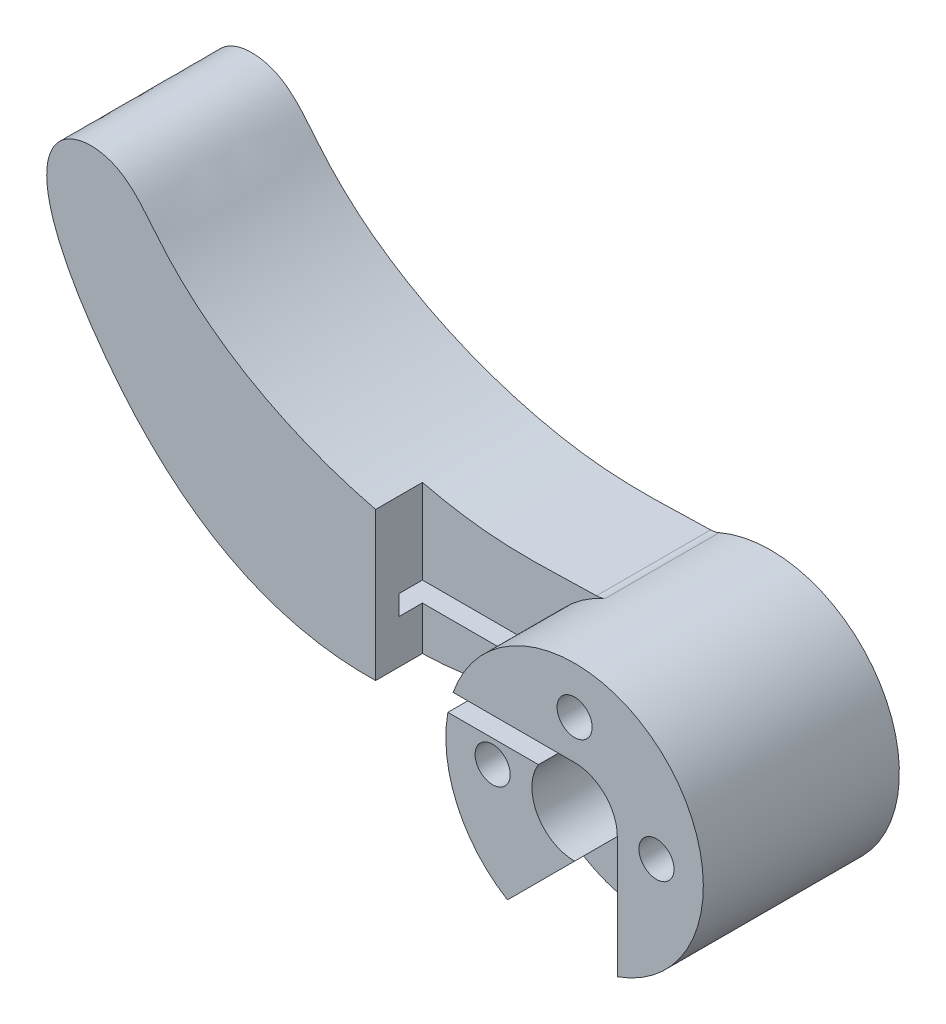
ISO-10303-21;
HEADER;
FILE_DESCRIPTION(('STEP AP214'),'2;1');
FILE_NAME('part.step','',(''),(''),'','','');
FILE_SCHEMA(('AUTOMOTIVE_DESIGN { 1 0 10303 214 1 1 1 1 }'));
ENDSEC;
DATA;
#1=APPLICATION_CONTEXT('core data for automotive mechanical design processes');
#2=APPLICATION_PROTOCOL_DEFINITION('international standard','automotive_design',2000,#1);
#3=PRODUCT_CONTEXT('',#1,'mechanical');
#4=PRODUCT('Part','Part','',(#3));
#5=PRODUCT_RELATED_PRODUCT_CATEGORY('part','',(#4));
#6=PRODUCT_DEFINITION_FORMATION('','',#4);
#7=PRODUCT_DEFINITION_CONTEXT('part definition',#1,'design');
#8=PRODUCT_DEFINITION('design','',#6,#7);
#9=PRODUCT_DEFINITION_SHAPE('','',#8);
#10=(LENGTH_UNIT() NAMED_UNIT(*) SI_UNIT(.MILLI.,.METRE.));
#11=(NAMED_UNIT(*) PLANE_ANGLE_UNIT() SI_UNIT($,.RADIAN.));
#12=(NAMED_UNIT(*) SI_UNIT($,.STERADIAN.) SOLID_ANGLE_UNIT());
#13=UNCERTAINTY_MEASURE_WITH_UNIT(LENGTH_MEASURE(1.E-05),#10,'distance_accuracy_value','');
#14=(GEOMETRIC_REPRESENTATION_CONTEXT(3) GLOBAL_UNCERTAINTY_ASSIGNED_CONTEXT((#13)) GLOBAL_UNIT_ASSIGNED_CONTEXT((#10,
#11,#12)) REPRESENTATION_CONTEXT('',''));
#15=CARTESIAN_POINT('',(0.,0.,0.));
#16=DIRECTION('',(0.,0.,1.));
#17=DIRECTION('',(1.,0.,0.));
#18=AXIS2_PLACEMENT_3D('',#15,#16,#17);
#19=CARTESIAN_POINT('',(-3.0854497241083,-23.05,6.25));
#20=DIRECTION('',(0.,-1.,0.));
#21=DIRECTION('',(1.,0.,0.));
#22=AXIS2_PLACEMENT_3D('',#19,#20,#21);
#23=PLANE('',#22);
#24=DIRECTION('',(1.,0.,0.));
#25=VECTOR('',#24,1.);
#26=CARTESIAN_POINT('',(-20.,-23.05,11.75));
#27=LINE('',#26,#25);
#28=CARTESIAN_POINT('',(-30.,-23.05,11.75));
#29=VERTEX_POINT('',#28);
#30=CARTESIAN_POINT('',(-20.,-23.05,11.75));
#31=VERTEX_POINT('',#30);
#32=EDGE_CURVE('E243',#29,#31,#27,.T.);
#33=ORIENTED_EDGE('',*,*,#32,.T.);
#34=DIRECTION('',(0.,0.,-1.));
#35=VECTOR('',#34,1.);
#36=CARTESIAN_POINT('',(-20.,-23.05,44.75));
#37=LINE('',#36,#35);
#38=CARTESIAN_POINT('',(-20.,-23.05,9.75));
#39=VERTEX_POINT('',#38);
#40=EDGE_CURVE('E274',#31,#39,#37,.T.);
#41=ORIENTED_EDGE('',*,*,#40,.T.);
#42=DIRECTION('',(1.,0.,0.));
#43=VECTOR('',#42,1.);
#44=CARTESIAN_POINT('',(-20.,-23.05,9.75));
#45=LINE('',#44,#43);
#46=CARTESIAN_POINT('',(-10.8257794176678,-23.05,9.75));
#47=VERTEX_POINT('',#46);
#48=EDGE_CURVE('E272',#39,#47,#45,.T.);
#49=ORIENTED_EDGE('',*,*,#48,.T.);
#50=DIRECTION('',(0.,0.,-1.));
#51=VECTOR('',#50,1.);
#52=CARTESIAN_POINT('',(-10.8257794176678,-23.05,44.8626983722081));
#53=LINE('',#52,#51);
#54=CARTESIAN_POINT('',(-10.8257794176678,-23.05,16.75));
#55=VERTEX_POINT('',#54);
#56=EDGE_CURVE('E497',#47,#55,#53,.F.);
#57=ORIENTED_EDGE('',*,*,#56,.T.);
#58=DIRECTION('',(-1.,0.,0.));
#59=VECTOR('',#58,1.);
#60=CARTESIAN_POINT('',(-3.0854497241083,-23.05,16.75));
#61=LINE('',#60,#59);
#62=CARTESIAN_POINT('',(-3.0854497241083,-23.05,16.75));
#63=VERTEX_POINT('',#62);
#64=EDGE_CURVE('E202',#63,#55,#61,.T.);
#65=ORIENTED_EDGE('',*,*,#64,.F.);
#66=DIRECTION('',(0.,0.,1.));
#67=VECTOR('',#66,1.);
#68=CARTESIAN_POINT('',(-3.0854497241083,-23.05,6.25));
#69=LINE('',#68,#67);
#70=CARTESIAN_POINT('',(-3.0854497241083,-23.05,6.25));
#71=VERTEX_POINT('',#70);
#72=EDGE_CURVE('E259',#71,#63,#69,.T.);
#73=ORIENTED_EDGE('',*,*,#72,.F.);
#74=DIRECTION('',(1.,0.,0.));
#75=VECTOR('',#74,1.);
#76=CARTESIAN_POINT('',(-3.0854497241083,-23.05,6.25));
#77=LINE('',#76,#75);
#78=CARTESIAN_POINT('',(-5.1325150603017,-23.05,6.25));
#79=VERTEX_POINT('',#78);
#80=EDGE_CURVE('E254',#79,#71,#77,.T.);
#81=ORIENTED_EDGE('',*,*,#80,.F.);
#82=DIRECTION('',(0.,0.,-1.));
#83=VECTOR('',#82,1.);
#84=CARTESIAN_POINT('',(-5.1325150603017,-23.05,13.25));
#85=LINE('',#84,#83);
#86=CARTESIAN_POINT('',(-5.1325150603017,-23.05,13.25));
#87=VERTEX_POINT('',#86);
#88=EDGE_CURVE('E278',#79,#87,#85,.F.);
#89=ORIENTED_EDGE('',*,*,#88,.T.);
#90=DIRECTION('',(-1.,0.,0.));
#91=VECTOR('',#90,1.);
#92=CARTESIAN_POINT('',(-7.,-23.05,13.25));
#93=LINE('',#92,#91);
#94=CARTESIAN_POINT('',(-8.86748493969831,-23.05,13.25));
#95=VERTEX_POINT('',#94);
#96=EDGE_CURVE('E276',#87,#95,#93,.T.);
#97=ORIENTED_EDGE('',*,*,#96,.T.);
#98=DIRECTION('',(0.,0.,-1.));
#99=VECTOR('',#98,1.);
#100=CARTESIAN_POINT('',(-8.86748493969831,-23.05,13.25));
#101=LINE('',#100,#99);
#102=CARTESIAN_POINT('',(-8.86748493969831,-23.05,6.25));
#103=VERTEX_POINT('',#102);
#104=EDGE_CURVE('E280',#95,#103,#101,.T.);
#105=ORIENTED_EDGE('',*,*,#104,.T.);
#106=CARTESIAN_POINT('',(-30.,-23.05,6.25));
#107=VERTEX_POINT('',#106);
#108=EDGE_CURVE('E255',#107,#103,#77,.T.);
#109=ORIENTED_EDGE('',*,*,#108,.F.);
#110=DIRECTION('',(0.,0.,1.));
#111=VECTOR('',#110,1.);
#112=CARTESIAN_POINT('',(-30.,-23.05,6.25));
#113=LINE('',#112,#111);
#114=EDGE_CURVE('E262',#107,#29,#113,.T.);
#115=ORIENTED_EDGE('',*,*,#114,.T.);
#116=EDGE_LOOP('',(#33,#41,#49,#57,#65,#73,#81,#89,#97,#105,#109,#115));
#117=FACE_BOUND('',#116,.T.);
#118=ADVANCED_FACE('F33',(#117),#23,.F.);
#119=CARTESIAN_POINT('',(-30.,-21.35,6.25));
#120=DIRECTION('',(-1.,0.,0.));
#121=DIRECTION('',(0.,-1.,0.));
#122=AXIS2_PLACEMENT_3D('',#119,#120,#121);
#123=PLANE('',#122);
#124=DIRECTION('',(0.,-1.,0.));
#125=VECTOR('',#124,1.);
#126=CARTESIAN_POINT('',(-30.,-23.05,11.75));
#127=LINE('',#126,#125);
#128=CARTESIAN_POINT('',(-30.,-21.35,11.75));
#129=VERTEX_POINT('',#128);
#130=EDGE_CURVE('E241',#129,#29,#127,.T.);
#131=ORIENTED_EDGE('',*,*,#130,.T.);
#132=ORIENTED_EDGE('',*,*,#114,.F.);
#133=DIRECTION('',(0.,-1.,0.));
#134=VECTOR('',#133,1.);
#135=CARTESIAN_POINT('',(-30.,-21.35,6.25));
#136=LINE('',#135,#134);
#137=CARTESIAN_POINT('',(-30.,-21.35,6.25));
#138=VERTEX_POINT('',#137);
#139=EDGE_CURVE('E251',#138,#107,#136,.T.);
#140=ORIENTED_EDGE('',*,*,#139,.F.);
#141=DIRECTION('',(0.,0.,1.));
#142=VECTOR('',#141,1.);
#143=CARTESIAN_POINT('',(-30.,-21.35,6.25));
#144=LINE('',#143,#142);
#145=EDGE_CURVE('E265',#138,#129,#144,.T.);
#146=ORIENTED_EDGE('',*,*,#145,.T.);
#147=EDGE_LOOP('',(#131,#132,#140,#146));
#148=FACE_BOUND('',#147,.T.);
#149=ADVANCED_FACE('F376',(#148),#123,.F.);
#150=CARTESIAN_POINT('',(0.,-21.35,6.25));
#151=DIRECTION('',(0.,1.,0.));
#152=DIRECTION('',(-1.,0.,0.));
#153=AXIS2_PLACEMENT_3D('',#150,#151,#152);
#154=PLANE('',#153);
#155=DIRECTION('',(-1.,0.,0.));
#156=VECTOR('',#155,1.);
#157=CARTESIAN_POINT('',(-20.,-21.35,11.75));
#158=LINE('',#157,#156);
#159=CARTESIAN_POINT('',(-20.,-21.35,11.75));
#160=VERTEX_POINT('',#159);
#161=EDGE_CURVE('E239',#160,#129,#158,.T.);
#162=ORIENTED_EDGE('',*,*,#161,.T.);
#163=ORIENTED_EDGE('',*,*,#145,.F.);
#164=DIRECTION('',(-1.,0.,0.));
#165=VECTOR('',#164,1.);
#166=CARTESIAN_POINT('',(0.,-21.35,6.25));
#167=LINE('',#166,#165);
#168=CARTESIAN_POINT('',(0.,-21.35,6.25));
#169=VERTEX_POINT('',#168);
#170=EDGE_CURVE('E248',#169,#138,#167,.T.);
#171=ORIENTED_EDGE('',*,*,#170,.F.);
#172=DIRECTION('',(0.,0.,1.));
#173=VECTOR('',#172,1.);
#174=CARTESIAN_POINT('',(0.,-21.35,6.25));
#175=LINE('',#174,#173);
#176=CARTESIAN_POINT('',(0.,-21.35,16.75));
#177=VERTEX_POINT('',#176);
#178=EDGE_CURVE('E258',#169,#177,#175,.T.);
#179=ORIENTED_EDGE('',*,*,#178,.T.);
#180=DIRECTION('',(1.,0.,0.));
#181=VECTOR('',#180,1.);
#182=CARTESIAN_POINT('',(-10.3767769562615,-21.35,16.75));
#183=LINE('',#182,#181);
#184=CARTESIAN_POINT('',(-10.3767769562615,-21.35,16.75));
#185=VERTEX_POINT('',#184);
#186=EDGE_CURVE('E225',#185,#177,#183,.T.);
#187=ORIENTED_EDGE('',*,*,#186,.F.);
#188=DIRECTION('',(0.,0.,-1.));
#189=VECTOR('',#188,1.);
#190=CARTESIAN_POINT('',(-10.3767769562615,-21.35,44.8626983722081));
#191=LINE('',#190,#189);
#192=CARTESIAN_POINT('',(-10.3767769562615,-21.35,9.75));
#193=VERTEX_POINT('',#192);
#194=EDGE_CURVE('E495',#185,#193,#191,.T.);
#195=ORIENTED_EDGE('',*,*,#194,.T.);
#196=DIRECTION('',(-1.,0.,0.));
#197=VECTOR('',#196,1.);
#198=CARTESIAN_POINT('',(-20.,-21.35,9.75));
#199=LINE('',#198,#197);
#200=CARTESIAN_POINT('',(-20.,-21.35,9.75));
#201=VERTEX_POINT('',#200);
#202=EDGE_CURVE('E261',#193,#201,#199,.T.);
#203=ORIENTED_EDGE('',*,*,#202,.T.);
#204=DIRECTION('',(0.,0.,1.));
#205=VECTOR('',#204,1.);
#206=CARTESIAN_POINT('',(-20.,-21.35,44.75));
#207=LINE('',#206,#205);
#208=EDGE_CURVE('E270',#201,#160,#207,.T.);
#209=ORIENTED_EDGE('',*,*,#208,.T.);
#210=EDGE_LOOP('',(#162,#163,#171,#179,#187,#195,#203,#209));
#211=FACE_BOUND('',#210,.T.);
#212=ADVANCED_FACE('F382',(#211),#154,.F.);
#213=CARTESIAN_POINT('',(-20.,5.,9.75));
#214=DIRECTION('',(0.,0.,1.));
#215=DIRECTION('',(1.,0.,0.));
#216=AXIS2_PLACEMENT_3D('',#213,#214,#215);
#217=PLANE('',#216);
#218=ORIENTED_EDGE('',*,*,#48,.F.);
#219=DIRECTION('',(0.,-1.,0.));
#220=VECTOR('',#219,1.);
#221=CARTESIAN_POINT('',(-20.,5.,9.75));
#222=LINE('',#221,#220);
#223=CARTESIAN_POINT('',(-20.,-26.7885708575753,9.75));
#224=VERTEX_POINT('',#223);
#225=EDGE_CURVE('E304',#39,#224,#222,.T.);
#226=ORIENTED_EDGE('',*,*,#225,.T.);
#227=CARTESIAN_POINT('',(-43.,-14.4816893196804,9.75));
#228=CARTESIAN_POINT('',(-34.4997708015538,-25.8253196137616,9.75));
#229=CARTESIAN_POINT('',(-23.4997708015538,-29.3314231738681,9.75));
#230=CARTESIAN_POINT('',(-10.,-25.,9.75));
#231=B_SPLINE_CURVE_WITH_KNOTS('',3,(#227,#228,#229,#230),.UNSPECIFIED.,.F.,.F.,(4,4),(0.,1.),.UNSPECIFIED.);
#232=CARTESIAN_POINT('',(-13.1488810570186,-25.8789172832054,9.75));
#233=VERTEX_POINT('',#232);
#234=EDGE_CURVE('E324',#224,#233,#231,.T.);
#235=ORIENTED_EDGE('',*,*,#234,.T.);
#236=CARTESIAN_POINT('',(-12.6892548700412,-27.8253868484041,9.75));
#237=DIRECTION('',(0.,0.,1.));
#238=DIRECTION('',(1.,0.,0.));
#239=AXIS2_PLACEMENT_3D('',#236,#237,#238);
#240=CIRCLE('',#239,2.);
#241=CARTESIAN_POINT('',(-10.7370618131118,-27.3907119486496,9.75));
#242=VERTEX_POINT('',#241);
#243=EDGE_CURVE('E515',#233,#242,#240,.F.);
#244=ORIENTED_EDGE('',*,*,#243,.T.);
#245=CARTESIAN_POINT('',(0.,-25.,9.75));
#246=DIRECTION('',(0.,0.,1.));
#247=DIRECTION('',(1.,0.,0.));
#248=AXIS2_PLACEMENT_3D('',#245,#246,#247);
#249=CIRCLE('',#248,11.);
#250=EDGE_CURVE('E491',#47,#242,#249,.T.);
#251=ORIENTED_EDGE('',*,*,#250,.F.);
#252=EDGE_LOOP('',(#218,#226,#235,#244,#251));
#253=FACE_BOUND('',#252,.T.);
#254=ADVANCED_FACE('F359',(#253),#217,.T.);
#255=CARTESIAN_POINT('',(0.,-15.,54.5));
#256=CARTESIAN_POINT('',(-7.03253454263391,-15.,54.5));
#257=CARTESIAN_POINT('',(-16.8634620389375,-16.2801328042469,54.5));
#258=CARTESIAN_POINT('',(-34.3402061821673,-9.88423584322541,54.5));
#259=CARTESIAN_POINT('',(-43.3409425550574,3.4478820338478,54.5));
#260=CARTESIAN_POINT('',(-53.0005504042175,-1.13586723955291,54.5));
#261=CARTESIAN_POINT('',(-43.,-14.4816893196804,54.5));
#262=B_SPLINE_CURVE_WITH_KNOTS('',3,(#255,#256,#257,#258,#259,#260,#261),.UNSPECIFIED.,.F.,.F.,
(4,1,1,1,4),(0.,0.248294096311982,0.674131075333051,0.76028618665666,1.),.UNSPECIFIED.);
#263=DIRECTION('',(0.,0.,-1.));
#264=VECTOR('',#263,1.);
#265=SURFACE_OF_LINEAR_EXTRUSION('',#262,#264);
#266=CARTESIAN_POINT('',(0.,-15.,9.75));
#267=CARTESIAN_POINT('',(-7.03253454263391,-15.,9.75));
#268=CARTESIAN_POINT('',(-16.8634620389375,-16.2801328042469,9.75));
#269=CARTESIAN_POINT('',(-34.3402061821673,-9.88423584322541,9.75));
#270=CARTESIAN_POINT('',(-43.3409425550574,3.4478820338478,9.75));
#271=CARTESIAN_POINT('',(-53.0005504042175,-1.13586723955291,9.75));
#272=CARTESIAN_POINT('',(-43.,-14.4816893196804,9.75));
#273=B_SPLINE_CURVE_WITH_KNOTS('',3,(#266,#267,#268,#269,#270,#271,#272),.UNSPECIFIED.,.F.,.F.,
(4,1,1,1,4),(0.,0.248294096311982,0.674131075333051,0.76028618665666,1.),.UNSPECIFIED.);
#274=CARTESIAN_POINT('',(-5.12916504602776,-15.0779549061957,9.75));
#275=VERTEX_POINT('',#274);
#276=CARTESIAN_POINT('',(-20.,-14.125415076322,9.75));
#277=VERTEX_POINT('',#276);
#278=EDGE_CURVE('E329',#275,#277,#273,.T.);
#279=ORIENTED_EDGE('',*,*,#278,.F.);
#280=DIRECTION('',(0.,0.,-1.));
#281=VECTOR('',#280,1.);
#282=CARTESIAN_POINT('',(-5.12916504602776,-15.0779549061957,9.75000000000002));
#283=LINE('',#282,#281);
#284=CARTESIAN_POINT('',(-5.12916504602776,-15.0779549061957,0.));
#285=VERTEX_POINT('',#284);
#286=EDGE_CURVE('E513',#275,#285,#283,.T.);
#287=ORIENTED_EDGE('',*,*,#286,.T.);
#288=CARTESIAN_POINT('',(0.,-15.,0.));
#289=CARTESIAN_POINT('',(-7.03253454263391,-15.,0.));
#290=CARTESIAN_POINT('',(-16.8634620389375,-16.2801328042469,0.));
#291=CARTESIAN_POINT('',(-34.3402061821673,-9.88423584322541,0.));
#292=CARTESIAN_POINT('',(-43.3409425550574,3.4478820338478,0.));
#293=CARTESIAN_POINT('',(-53.0005504042175,-1.13586723955291,0.));
#294=CARTESIAN_POINT('',(-43.,-14.4816893196804,0.));
#295=B_SPLINE_CURVE_WITH_KNOTS('',3,(#288,#289,#290,#291,#292,#293,#294),.UNSPECIFIED.,.F.,.F.,
(4,1,1,1,4),(0.,0.248294096311982,0.674131075333051,0.76028618665666,1.),.UNSPECIFIED.);
#296=CARTESIAN_POINT('',(-43.,-14.4816893196804,0.));
#297=VERTEX_POINT('',#296);
#298=EDGE_CURVE('E342',#285,#297,#295,.T.);
#299=ORIENTED_EDGE('',*,*,#298,.T.);
#300=DIRECTION('',(0.,0.,-1.));
#301=VECTOR('',#300,1.);
#302=CARTESIAN_POINT('',(-43.,-14.4816893196804,54.5));
#303=LINE('',#302,#301);
#304=CARTESIAN_POINT('',(-43.,-14.4816893196804,13.75));
#305=VERTEX_POINT('',#304);
#306=EDGE_CURVE('E465',#305,#297,#303,.T.);
#307=ORIENTED_EDGE('',*,*,#306,.F.);
#308=CARTESIAN_POINT('',(0.,-15.,13.75));
#309=CARTESIAN_POINT('',(-7.03253454263391,-15.,13.75));
#310=CARTESIAN_POINT('',(-16.8634620389375,-16.2801328042469,13.75));
#311=CARTESIAN_POINT('',(-34.3402061821673,-9.88423584322541,13.75));
#312=CARTESIAN_POINT('',(-43.3409425550574,3.4478820338478,13.75));
#313=CARTESIAN_POINT('',(-53.0005504042175,-1.13586723955291,13.75));
#314=CARTESIAN_POINT('',(-43.,-14.4816893196804,13.75));
#315=B_SPLINE_CURVE_WITH_KNOTS('',3,(#308,#309,#310,#311,#312,#313,#314),.UNSPECIFIED.,.F.,.F.,
(4,1,1,1,4),(0.,0.248294096311982,0.674131075333051,0.76028618665666,1.),.UNSPECIFIED.);
#316=CARTESIAN_POINT('',(-20.,-14.125415076322,13.75));
#317=VERTEX_POINT('',#316);
#318=EDGE_CURVE('E290',#317,#305,#315,.T.);
#319=ORIENTED_EDGE('',*,*,#318,.F.);
#320=DIRECTION('',(0.,0.,-1.));
#321=VECTOR('',#320,1.);
#322=CARTESIAN_POINT('',(-20.,-14.1254150763219,54.5));
#323=LINE('',#322,#321);
#324=EDGE_CURVE('E336',#277,#317,#323,.F.);
#325=ORIENTED_EDGE('',*,*,#324,.F.);
#326=EDGE_LOOP('',(#279,#287,#299,#307,#319,#325));
#327=FACE_BOUND('',#326,.T.);
#328=ADVANCED_FACE('F355',(#327),#265,.F.);
#329=CARTESIAN_POINT('',(-43.,-14.4816893196804,54.5));
#330=CARTESIAN_POINT('',(-34.4997708015538,-25.8253196137616,54.5));
#331=CARTESIAN_POINT('',(-23.4997708015538,-29.3314231738681,54.5));
#332=CARTESIAN_POINT('',(-10.,-25.,54.5));
#333=B_SPLINE_CURVE_WITH_KNOTS('',3,(#329,#330,#331,#332),.UNSPECIFIED.,.F.,.F.,(4,4),(0.,1.),.UNSPECIFIED.);
#334=DIRECTION('',(0.,0.,-1.));
#335=VECTOR('',#334,1.);
#336=SURFACE_OF_LINEAR_EXTRUSION('',#333,#335);
#337=CARTESIAN_POINT('',(-43.,-14.4816893196804,0.));
#338=CARTESIAN_POINT('',(-34.4997708015538,-25.8253196137616,0.));
#339=CARTESIAN_POINT('',(-23.4997708015538,-29.3314231738681,0.));
#340=CARTESIAN_POINT('',(-10.,-25.,0.));
#341=B_SPLINE_CURVE_WITH_KNOTS('',3,(#337,#338,#339,#340),.UNSPECIFIED.,.F.,.F.,(4,4),(0.,1.),.UNSPECIFIED.);
#342=CARTESIAN_POINT('',(-13.1488810570186,-25.8789172832054,0.));
#343=VERTEX_POINT('',#342);
#344=EDGE_CURVE('E462',#297,#343,#341,.T.);
#345=ORIENTED_EDGE('',*,*,#344,.T.);
#346=DIRECTION('',(0.,0.,-1.));
#347=VECTOR('',#346,1.);
#348=CARTESIAN_POINT('',(-13.1488810570186,-25.8789172832054,0.));
#349=LINE('',#348,#347);
#350=EDGE_CURVE('E505',#343,#233,#349,.F.);
#351=ORIENTED_EDGE('',*,*,#350,.T.);
#352=ORIENTED_EDGE('',*,*,#234,.F.);
#353=DIRECTION('',(0.,0.,-1.));
#354=VECTOR('',#353,1.);
#355=CARTESIAN_POINT('',(-20.,-26.7885708575754,54.5));
#356=LINE('',#355,#354);
#357=CARTESIAN_POINT('',(-20.,-26.7885708575754,13.75));
#358=VERTEX_POINT('',#357);
#359=EDGE_CURVE('E479',#358,#224,#356,.T.);
#360=ORIENTED_EDGE('',*,*,#359,.F.);
#361=CARTESIAN_POINT('',(-43.,-14.4816893196804,13.75));
#362=CARTESIAN_POINT('',(-34.4997708015538,-25.8253196137616,13.75));
#363=CARTESIAN_POINT('',(-23.4997708015538,-29.3314231738681,13.75));
#364=CARTESIAN_POINT('',(-10.,-25.,13.75));
#365=B_SPLINE_CURVE_WITH_KNOTS('',3,(#361,#362,#363,#364),.UNSPECIFIED.,.F.,.F.,(4,4),(0.,1.),.UNSPECIFIED.);
#366=EDGE_CURVE('E285',#305,#358,#365,.T.);
#367=ORIENTED_EDGE('',*,*,#366,.F.);
#368=ORIENTED_EDGE('',*,*,#306,.T.);
#369=EDGE_LOOP('',(#345,#351,#352,#360,#367,#368));
#370=FACE_BOUND('',#369,.T.);
#371=ADVANCED_FACE('F358',(#370),#336,.F.);
#372=CARTESIAN_POINT('',(-20.,5.,44.75));
#373=DIRECTION('',(1.,0.,0.));
#374=DIRECTION('',(0.,0.,-1.));
#375=AXIS2_PLACEMENT_3D('',#372,#373,#374);
#376=PLANE('',#375);
#377=ORIENTED_EDGE('',*,*,#208,.F.);
#378=EDGE_CURVE('E321',#277,#201,#222,.T.);
#379=ORIENTED_EDGE('',*,*,#378,.F.);
#380=ORIENTED_EDGE('',*,*,#324,.T.);
#381=DIRECTION('',(0.,-1.,0.));
#382=VECTOR('',#381,1.);
#383=CARTESIAN_POINT('',(-20.,5.,13.75));
#384=LINE('',#383,#382);
#385=EDGE_CURVE('E482',#317,#358,#384,.T.);
#386=ORIENTED_EDGE('',*,*,#385,.T.);
#387=ORIENTED_EDGE('',*,*,#359,.T.);
#388=ORIENTED_EDGE('',*,*,#225,.F.);
#389=ORIENTED_EDGE('',*,*,#40,.F.);
#390=DIRECTION('',(0.,1.,0.));
#391=VECTOR('',#390,1.);
#392=CARTESIAN_POINT('',(-20.,-23.05,11.75));
#393=LINE('',#392,#391);
#394=EDGE_CURVE('E185',#31,#160,#393,.T.);
#395=ORIENTED_EDGE('',*,*,#394,.T.);
#396=EDGE_LOOP('',(#377,#379,#380,#386,#387,#388,#389,#395));
#397=FACE_BOUND('',#396,.T.);
#398=ADVANCED_FACE('F442',(#397),#376,.T.);
#399=CARTESIAN_POINT('',(-29.4892307695444,-10.5497019604437,0.));
#400=DIRECTION('',(0.,0.,-1.));
#401=DIRECTION('',(-1.,0.,0.));
#402=AXIS2_PLACEMENT_3D('',#399,#400,#401);
#403=PLANE('',#402);
#404=ORIENTED_EDGE('',*,*,#298,.F.);
#405=CARTESIAN_POINT('',(-5.1849178254153,-13.0787321503252,0.));
#406=DIRECTION('',(0.,0.,-1.));
#407=DIRECTION('',(-1.,0.,0.));
#408=AXIS2_PLACEMENT_3D('',#405,#406,#407);
#409=CIRCLE('',#408,2.);
#410=CARTESIAN_POINT('',(-4.38723815996679,-14.9127733579675,0.));
#411=VERTEX_POINT('',#410);
#412=EDGE_CURVE('E41',#285,#411,#409,.F.);
#413=ORIENTED_EDGE('',*,*,#412,.T.);
#414=CARTESIAN_POINT('',(0.,-25.,0.));
#415=DIRECTION('',(0.,0.,-1.));
#416=DIRECTION('',(-1.,0.,0.));
#417=AXIS2_PLACEMENT_3D('',#414,#415,#416);
#418=CIRCLE('',#417,11.);
#419=CARTESIAN_POINT('',(-10.7370618131118,-27.3907119486496,0.));
#420=VERTEX_POINT('',#419);
#421=EDGE_CURVE('E282',#411,#420,#418,.T.);
#422=ORIENTED_EDGE('',*,*,#421,.T.);
#423=CARTESIAN_POINT('',(-12.6892548700412,-27.8253868484041,0.));
#424=DIRECTION('',(0.,0.,-1.));
#425=DIRECTION('',(-1.,0.,0.));
#426=AXIS2_PLACEMENT_3D('',#423,#424,#425);
#427=CIRCLE('',#426,2.);
#428=EDGE_CURVE('E518',#420,#343,#427,.F.);
#429=ORIENTED_EDGE('',*,*,#428,.T.);
#430=ORIENTED_EDGE('',*,*,#344,.F.);
#431=EDGE_LOOP('',(#404,#413,#422,#429,#430));
#432=FACE_BOUND('',#431,.T.);
#433=CARTESIAN_POINT('',(-7.00000000000001,-25.,0.));
#434=DIRECTION('',(0.,0.,1.));
#435=DIRECTION('',(1.,0.,0.));
#436=AXIS2_PLACEMENT_3D('',#433,#434,#435);
#437=CIRCLE('',#436,2.7);
#438=CARTESIAN_POINT('',(-4.30000000000001,-25.,0.));
#439=VERTEX_POINT('',#438);
#440=EDGE_CURVE('E305',#439,#439,#437,.T.);
#441=ORIENTED_EDGE('',*,*,#440,.T.);
#442=EDGE_LOOP('',(#441));
#443=FACE_BOUND('',#442,.T.);
#444=CARTESIAN_POINT('',(0.,-18.,0.));
#445=DIRECTION('',(0.,0.,1.));
#446=DIRECTION('',(1.,0.,0.));
#447=AXIS2_PLACEMENT_3D('',#444,#445,#446);
#448=CIRCLE('',#447,2.7);
#449=CARTESIAN_POINT('',(2.69999999999999,-18.,0.));
#450=VERTEX_POINT('',#449);
#451=EDGE_CURVE('E311',#450,#450,#448,.T.);
#452=ORIENTED_EDGE('',*,*,#451,.T.);
#453=EDGE_LOOP('',(#452));
#454=FACE_BOUND('',#453,.T.);
#455=CARTESIAN_POINT('',(6.99999999999999,-25.,0.));
#456=DIRECTION('',(0.,0.,1.));
#457=DIRECTION('',(1.,0.,0.));
#458=AXIS2_PLACEMENT_3D('',#455,#456,#457);
#459=CIRCLE('',#458,2.7);
#460=CARTESIAN_POINT('',(9.69999999999999,-25.,0.));
#461=VERTEX_POINT('',#460);
#462=EDGE_CURVE('E317',#461,#461,#459,.T.);
#463=ORIENTED_EDGE('',*,*,#462,.T.);
#464=EDGE_LOOP('',(#463));
#465=FACE_BOUND('',#464,.T.);
#466=ADVANCED_FACE('F441',(#432,#443,#454,#465),#403,.T.);
#467=ORIENTED_EDGE('',*,*,#202,.F.);
#468=CARTESIAN_POINT('',(-4.38723815996679,-14.9127733579675,9.75));
#469=VERTEX_POINT('',#468);
#470=EDGE_CURVE('E492',#469,#193,#249,.T.);
#471=ORIENTED_EDGE('',*,*,#470,.F.);
#472=CARTESIAN_POINT('',(-5.1849178254153,-13.0787321503252,9.75));
#473=DIRECTION('',(0.,0.,1.));
#474=DIRECTION('',(1.,0.,0.));
#475=AXIS2_PLACEMENT_3D('',#472,#473,#474);
#476=CIRCLE('',#475,2.);
#477=EDGE_CURVE('E11',#469,#275,#476,.F.);
#478=ORIENTED_EDGE('',*,*,#477,.T.);
#479=ORIENTED_EDGE('',*,*,#278,.T.);
#480=ORIENTED_EDGE('',*,*,#378,.T.);
#481=EDGE_LOOP('',(#467,#471,#478,#479,#480));
#482=FACE_BOUND('',#481,.T.);
#483=ADVANCED_FACE('F437',(#482),#217,.T.);
#484=CARTESIAN_POINT('',(6.99999999999999,-25.,13.25));
#485=DIRECTION('',(0.,0.,-1.));
#486=DIRECTION('',(-1.,0.,0.));
#487=AXIS2_PLACEMENT_3D('',#484,#485,#486);
#488=CYLINDRICAL_SURFACE('',#487,2.7);
#489=CARTESIAN_POINT('',(6.99999999999999,-25.,13.25));
#490=DIRECTION('',(0.,0.,1.));
#491=DIRECTION('',(1.,0.,0.));
#492=AXIS2_PLACEMENT_3D('',#489,#490,#491);
#493=CIRCLE('',#492,2.7);
#494=CARTESIAN_POINT('',(9.7,-25.,13.25));
#495=VERTEX_POINT('',#494);
#496=EDGE_CURVE('E314',#495,#495,#493,.T.);
#497=ORIENTED_EDGE('',*,*,#496,.T.);
#498=EDGE_LOOP('',(#497));
#499=FACE_BOUND('',#498,.T.);
#500=ORIENTED_EDGE('',*,*,#462,.F.);
#501=EDGE_LOOP('',(#500));
#502=FACE_BOUND('',#501,.T.);
#503=ADVANCED_FACE('F433',(#499,#502),#488,.F.);
#504=CARTESIAN_POINT('',(6.99999999999999,-25.,13.25));
#505=DIRECTION('',(0.,0.,-1.));
#506=DIRECTION('',(1.,0.,0.));
#507=AXIS2_PLACEMENT_3D('',#504,#505,#506);
#508=PLANE('',#507);
#509=CARTESIAN_POINT('',(7.,-25.,13.25));
#510=DIRECTION('',(0.,0.,-1.));
#511=DIRECTION('',(-1.,0.,0.));
#512=AXIS2_PLACEMENT_3D('',#509,#510,#511);
#513=CIRCLE('',#512,1.5);
#514=CARTESIAN_POINT('',(5.49999999999999,-25.,13.25));
#515=VERTEX_POINT('',#514);
#516=EDGE_CURVE('E320',#515,#515,#513,.T.);
#517=ORIENTED_EDGE('',*,*,#516,.F.);
#518=EDGE_LOOP('',(#517));
#519=FACE_BOUND('',#518,.T.);
#520=ORIENTED_EDGE('',*,*,#496,.F.);
#521=EDGE_LOOP('',(#520));
#522=FACE_BOUND('',#521,.T.);
#523=ADVANCED_FACE('F429',(#519,#522),#508,.T.);
#524=CARTESIAN_POINT('',(0.,-18.,13.25));
#525=DIRECTION('',(0.,0.,-1.));
#526=DIRECTION('',(-1.,0.,0.));
#527=AXIS2_PLACEMENT_3D('',#524,#525,#526);
#528=CYLINDRICAL_SURFACE('',#527,2.7);
#529=CARTESIAN_POINT('',(0.,-18.,13.25));
#530=DIRECTION('',(0.,0.,1.));
#531=DIRECTION('',(1.,0.,0.));
#532=AXIS2_PLACEMENT_3D('',#529,#530,#531);
#533=CIRCLE('',#532,2.7);
#534=CARTESIAN_POINT('',(2.69999999999999,-18.,13.25));
#535=VERTEX_POINT('',#534);
#536=EDGE_CURVE('E308',#535,#535,#533,.T.);
#537=ORIENTED_EDGE('',*,*,#536,.T.);
#538=EDGE_LOOP('',(#537));
#539=FACE_BOUND('',#538,.T.);
#540=ORIENTED_EDGE('',*,*,#451,.F.);
#541=EDGE_LOOP('',(#540));
#542=FACE_BOUND('',#541,.T.);
#543=ADVANCED_FACE('F425',(#539,#542),#528,.F.);
#544=CARTESIAN_POINT('',(0.,-18.,13.25));
#545=DIRECTION('',(0.,0.,-1.));
#546=DIRECTION('',(1.,0.,0.));
#547=AXIS2_PLACEMENT_3D('',#544,#545,#546);
#548=PLANE('',#547);
#549=CARTESIAN_POINT('',(0.,-18.,13.25));
#550=DIRECTION('',(0.,0.,-1.));
#551=DIRECTION('',(-1.,0.,0.));
#552=AXIS2_PLACEMENT_3D('',#549,#550,#551);
#553=CIRCLE('',#552,1.5);
#554=CARTESIAN_POINT('',(-1.5,-18.,13.25));
#555=VERTEX_POINT('',#554);
#556=EDGE_CURVE('E485',#555,#555,#553,.T.);
#557=ORIENTED_EDGE('',*,*,#556,.F.);
#558=EDGE_LOOP('',(#557));
#559=FACE_BOUND('',#558,.T.);
#560=ORIENTED_EDGE('',*,*,#536,.F.);
#561=EDGE_LOOP('',(#560));
#562=FACE_BOUND('',#561,.T.);
#563=ADVANCED_FACE('F421',(#559,#562),#548,.T.);
#564=CARTESIAN_POINT('',(-7.,-25.,13.25));
#565=DIRECTION('',(0.,0.,-1.));
#566=DIRECTION('',(-1.,0.,0.));
#567=AXIS2_PLACEMENT_3D('',#564,#565,#566);
#568=CYLINDRICAL_SURFACE('',#567,2.7);
#569=ORIENTED_EDGE('',*,*,#104,.F.);
#570=CARTESIAN_POINT('',(-7.,-25.,13.25));
#571=DIRECTION('',(0.,0.,1.));
#572=DIRECTION('',(1.,0.,0.));
#573=AXIS2_PLACEMENT_3D('',#570,#571,#572);
#574=CIRCLE('',#573,2.7);
#575=EDGE_CURVE('E298',#95,#87,#574,.T.);
#576=ORIENTED_EDGE('',*,*,#575,.T.);
#577=ORIENTED_EDGE('',*,*,#88,.F.);
#578=CARTESIAN_POINT('',(-7.00000000000001,-25.,6.25));
#579=DIRECTION('',(0.,0.,1.));
#580=DIRECTION('',(1.,0.,0.));
#581=AXIS2_PLACEMENT_3D('',#578,#579,#580);
#582=CIRCLE('',#581,2.7);
#583=EDGE_CURVE('E499',#79,#103,#582,.T.);
#584=ORIENTED_EDGE('',*,*,#583,.T.);
#585=EDGE_LOOP('',(#569,#576,#577,#584));
#586=FACE_BOUND('',#585,.T.);
#587=ORIENTED_EDGE('',*,*,#440,.F.);
#588=EDGE_LOOP('',(#587));
#589=FACE_BOUND('',#588,.T.);
#590=ADVANCED_FACE('F417',(#586,#589),#568,.F.);
#591=CARTESIAN_POINT('',(-7.,-25.,13.25));
#592=DIRECTION('',(0.,0.,-1.));
#593=DIRECTION('',(1.,0.,0.));
#594=AXIS2_PLACEMENT_3D('',#591,#592,#593);
#595=PLANE('',#594);
#596=ORIENTED_EDGE('',*,*,#96,.F.);
#597=ORIENTED_EDGE('',*,*,#575,.F.);
#598=EDGE_LOOP('',(#596,#597));
#599=FACE_BOUND('',#598,.T.);
#600=CARTESIAN_POINT('',(-7.,-25.,13.25));
#601=DIRECTION('',(0.,0.,-1.));
#602=DIRECTION('',(-1.,0.,0.));
#603=AXIS2_PLACEMENT_3D('',#600,#601,#602);
#604=CIRCLE('',#603,1.5);
#605=CARTESIAN_POINT('',(-8.5,-25.,13.25));
#606=VERTEX_POINT('',#605);
#607=EDGE_CURVE('E297',#606,#606,#604,.T.);
#608=ORIENTED_EDGE('',*,*,#607,.F.);
#609=EDGE_LOOP('',(#608));
#610=FACE_BOUND('',#609,.T.);
#611=ADVANCED_FACE('F413',(#599,#610),#595,.T.);
#612=CARTESIAN_POINT('',(-7.,-25.,0.));
#613=DIRECTION('',(0.,0.,1.));
#614=DIRECTION('',(1.,0.,0.));
#615=AXIS2_PLACEMENT_3D('',#612,#613,#614);
#616=CYLINDRICAL_SURFACE('',#615,1.5);
#617=ORIENTED_EDGE('',*,*,#607,.T.);
#618=EDGE_LOOP('',(#617));
#619=FACE_BOUND('',#618,.T.);
#620=CARTESIAN_POINT('',(-7.,-25.,16.75));
#621=DIRECTION('',(0.,0.,1.));
#622=DIRECTION('',(1.,0.,0.));
#623=AXIS2_PLACEMENT_3D('',#620,#621,#622);
#624=CIRCLE('',#623,1.5);
#625=CARTESIAN_POINT('',(-5.5,-25.,16.75));
#626=VERTEX_POINT('',#625);
#627=EDGE_CURVE('E203',#626,#626,#624,.T.);
#628=ORIENTED_EDGE('',*,*,#627,.T.);
#629=EDGE_LOOP('',(#628));
#630=FACE_BOUND('',#629,.T.);
#631=ADVANCED_FACE('F406',(#619,#630),#616,.F.);
#632=CARTESIAN_POINT('',(0.,-18.,0.));
#633=DIRECTION('',(0.,0.,1.));
#634=DIRECTION('',(1.,0.,0.));
#635=AXIS2_PLACEMENT_3D('',#632,#633,#634);
#636=CYLINDRICAL_SURFACE('',#635,1.5);
#637=ORIENTED_EDGE('',*,*,#556,.T.);
#638=EDGE_LOOP('',(#637));
#639=FACE_BOUND('',#638,.T.);
#640=CARTESIAN_POINT('',(0.,-18.,16.75));
#641=DIRECTION('',(0.,0.,1.));
#642=DIRECTION('',(1.,0.,0.));
#643=AXIS2_PLACEMENT_3D('',#640,#641,#642);
#644=CIRCLE('',#643,1.5);
#645=CARTESIAN_POINT('',(1.5,-18.,16.75));
#646=VERTEX_POINT('',#645);
#647=EDGE_CURVE('E210',#646,#646,#644,.T.);
#648=ORIENTED_EDGE('',*,*,#647,.T.);
#649=EDGE_LOOP('',(#648));
#650=FACE_BOUND('',#649,.T.);
#651=ADVANCED_FACE('F403',(#639,#650),#636,.F.);
#652=CARTESIAN_POINT('',(7.,-25.,0.));
#653=DIRECTION('',(0.,0.,1.));
#654=DIRECTION('',(1.,0.,0.));
#655=AXIS2_PLACEMENT_3D('',#652,#653,#654);
#656=CYLINDRICAL_SURFACE('',#655,1.5);
#657=ORIENTED_EDGE('',*,*,#516,.T.);
#658=EDGE_LOOP('',(#657));
#659=FACE_BOUND('',#658,.T.);
#660=CARTESIAN_POINT('',(7.,-25.,16.75));
#661=DIRECTION('',(0.,0.,1.));
#662=DIRECTION('',(1.,0.,0.));
#663=AXIS2_PLACEMENT_3D('',#660,#661,#662);
#664=CIRCLE('',#663,1.5);
#665=CARTESIAN_POINT('',(8.5,-25.,16.75));
#666=VERTEX_POINT('',#665);
#667=EDGE_CURVE('E213',#666,#666,#664,.T.);
#668=ORIENTED_EDGE('',*,*,#667,.T.);
#669=EDGE_LOOP('',(#668));
#670=FACE_BOUND('',#669,.T.);
#671=ADVANCED_FACE('F401',(#659,#670),#656,.F.);
#672=CARTESIAN_POINT('',(0.,-25.,13.75));
#673=DIRECTION('',(0.,0.,1.));
#674=DIRECTION('',(-1.,0.,0.));
#675=AXIS2_PLACEMENT_3D('',#672,#673,#674);
#676=PLANE('',#675);
#677=ORIENTED_EDGE('',*,*,#366,.T.);
#678=ORIENTED_EDGE('',*,*,#385,.F.);
#679=ORIENTED_EDGE('',*,*,#318,.T.);
#680=EDGE_LOOP('',(#677,#678,#679));
#681=FACE_BOUND('',#680,.T.);
#682=ADVANCED_FACE('F398',(#681),#676,.T.);
#683=CARTESIAN_POINT('',(0.,-25.,44.8626983722081));
#684=DIRECTION('',(0.,0.,-1.));
#685=DIRECTION('',(-1.,0.,0.));
#686=AXIS2_PLACEMENT_3D('',#683,#684,#685);
#687=CYLINDRICAL_SURFACE('',#686,11.);
#688=ORIENTED_EDGE('',*,*,#250,.T.);
#689=DIRECTION('',(0.,0.,-1.));
#690=VECTOR('',#689,1.);
#691=CARTESIAN_POINT('',(-10.7370618131118,-27.3907119486496,44.8626983722081));
#692=LINE('',#691,#690);
#693=EDGE_CURVE('E511',#242,#420,#692,.T.);
#694=ORIENTED_EDGE('',*,*,#693,.T.);
#695=ORIENTED_EDGE('',*,*,#421,.F.);
#696=DIRECTION('',(0.,0.,-1.));
#697=VECTOR('',#696,1.);
#698=CARTESIAN_POINT('',(-4.38723815996679,-14.9127733579675,44.8626983722081));
#699=LINE('',#698,#697);
#700=EDGE_CURVE('E508',#411,#469,#699,.F.);
#701=ORIENTED_EDGE('',*,*,#700,.T.);
#702=ORIENTED_EDGE('',*,*,#470,.T.);
#703=ORIENTED_EDGE('',*,*,#194,.F.);
#704=CARTESIAN_POINT('',(0.,-25.,16.75));
#705=DIRECTION('',(0.,0.,1.));
#706=DIRECTION('',(1.,0.,0.));
#707=AXIS2_PLACEMENT_3D('',#704,#705,#706);
#708=CIRCLE('',#707,11.);
#709=CARTESIAN_POINT('',(3.65,-35.3767769562615,16.75));
#710=VERTEX_POINT('',#709);
#711=EDGE_CURVE('E222',#710,#185,#708,.T.);
#712=ORIENTED_EDGE('',*,*,#711,.F.);
#713=DIRECTION('',(0.,0.,-1.));
#714=VECTOR('',#713,1.);
#715=CARTESIAN_POINT('',(3.65,-35.3767769562615,44.8626983722081));
#716=LINE('',#715,#714);
#717=CARTESIAN_POINT('',(3.65,-35.3767769562615,10.25));
#718=VERTEX_POINT('',#717);
#719=EDGE_CURVE('E186',#718,#710,#716,.F.);
#720=ORIENTED_EDGE('',*,*,#719,.F.);
#721=CARTESIAN_POINT('',(0.,-25.,10.25));
#722=DIRECTION('',(0.,0.,1.));
#723=DIRECTION('',(1.,0.,0.));
#724=AXIS2_PLACEMENT_3D('',#721,#722,#723);
#725=CIRCLE('',#724,11.);
#726=CARTESIAN_POINT('',(-5.73604324812392,-34.3860432481239,10.25));
#727=VERTEX_POINT('',#726);
#728=EDGE_CURVE('E181',#718,#727,#725,.F.);
#729=ORIENTED_EDGE('',*,*,#728,.T.);
#730=DIRECTION('',(0.,0.,-1.));
#731=VECTOR('',#730,1.);
#732=CARTESIAN_POINT('',(-5.73604324812392,-34.3860432481239,44.8626983722081));
#733=LINE('',#732,#731);
#734=CARTESIAN_POINT('',(-5.73604324812392,-34.3860432481239,16.75));
#735=VERTEX_POINT('',#734);
#736=EDGE_CURVE('E174',#735,#727,#733,.T.);
#737=ORIENTED_EDGE('',*,*,#736,.F.);
#738=CARTESIAN_POINT('',(0.,-25.,16.75));
#739=DIRECTION('',(0.,0.,1.));
#740=DIRECTION('',(1.,0.,0.));
#741=AXIS2_PLACEMENT_3D('',#738,#739,#740);
#742=CIRCLE('',#741,11.);
#743=EDGE_CURVE('E179',#55,#735,#742,.T.);
#744=ORIENTED_EDGE('',*,*,#743,.F.);
#745=ORIENTED_EDGE('',*,*,#56,.F.);
#746=EDGE_LOOP('',(#688,#694,#695,#701,#702,#703,#712,#720,#729,#737,#744,#745));
#747=FACE_BOUND('',#746,.T.);
#748=ADVANCED_FACE('F176',(#747),#687,.T.);
#749=CARTESIAN_POINT('',(0.,-25.,6.25));
#750=DIRECTION('',(0.,0.,1.));
#751=DIRECTION('',(1.,0.,0.));
#752=AXIS2_PLACEMENT_3D('',#749,#750,#751);
#753=CYLINDRICAL_SURFACE('',#752,3.65);
#754=ORIENTED_EDGE('',*,*,#72,.T.);
#755=CARTESIAN_POINT('',(0.,-25.,16.75));
#756=DIRECTION('',(0.,0.,-1.));
#757=DIRECTION('',(1.,0.,0.));
#758=AXIS2_PLACEMENT_3D('',#755,#756,#757);
#759=CIRCLE('',#758,3.65);
#760=CARTESIAN_POINT('',(0.,-28.65,16.75));
#761=VERTEX_POINT('',#760);
#762=EDGE_CURVE('E196',#761,#63,#759,.T.);
#763=ORIENTED_EDGE('',*,*,#762,.F.);
#764=DIRECTION('',(0.,0.,1.));
#765=VECTOR('',#764,1.);
#766=CARTESIAN_POINT('',(0.,-28.65,6.25));
#767=LINE('',#766,#765);
#768=CARTESIAN_POINT('',(0.,-28.65,10.25));
#769=VERTEX_POINT('',#768);
#770=EDGE_CURVE('E192',#761,#769,#767,.F.);
#771=ORIENTED_EDGE('',*,*,#770,.T.);
#772=CARTESIAN_POINT('',(0.,-25.,10.25));
#773=DIRECTION('',(0.,0.,1.));
#774=DIRECTION('',(1.,0.,0.));
#775=AXIS2_PLACEMENT_3D('',#772,#773,#774);
#776=CIRCLE('',#775,3.65);
#777=CARTESIAN_POINT('',(3.64999999999999,-25.,10.25));
#778=VERTEX_POINT('',#777);
#779=EDGE_CURVE('E502',#778,#769,#776,.F.);
#780=ORIENTED_EDGE('',*,*,#779,.F.);
#781=DIRECTION('',(0.,0.,1.));
#782=VECTOR('',#781,1.);
#783=CARTESIAN_POINT('',(3.65,-25.,10.25));
#784=LINE('',#783,#782);
#785=CARTESIAN_POINT('',(3.65,-25.,16.75));
#786=VERTEX_POINT('',#785);
#787=EDGE_CURVE('E233',#778,#786,#784,.T.);
#788=ORIENTED_EDGE('',*,*,#787,.T.);
#789=CARTESIAN_POINT('',(0.,-25.,16.75));
#790=DIRECTION('',(0.,0.,-1.));
#791=DIRECTION('',(1.,0.,0.));
#792=AXIS2_PLACEMENT_3D('',#789,#790,#791);
#793=CIRCLE('',#792,3.65);
#794=EDGE_CURVE('E216',#177,#786,#793,.T.);
#795=ORIENTED_EDGE('',*,*,#794,.F.);
#796=ORIENTED_EDGE('',*,*,#178,.F.);
#797=CARTESIAN_POINT('',(0.,-25.,6.25));
#798=DIRECTION('',(0.,0.,1.));
#799=DIRECTION('',(1.,0.,0.));
#800=AXIS2_PLACEMENT_3D('',#797,#798,#799);
#801=CIRCLE('',#800,3.65);
#802=EDGE_CURVE('E245',#71,#169,#801,.T.);
#803=ORIENTED_EDGE('',*,*,#802,.F.);
#804=EDGE_LOOP('',(#754,#763,#771,#780,#788,#795,#796,#803));
#805=FACE_BOUND('',#804,.T.);
#806=ADVANCED_FACE('F392',(#805),#753,.F.);
#807=CARTESIAN_POINT('',(0.,-25.,6.25));
#808=DIRECTION('',(0.,0.,1.));
#809=DIRECTION('',(1.,0.,0.));
#810=AXIS2_PLACEMENT_3D('',#807,#808,#809);
#811=PLANE('',#810);
#812=ORIENTED_EDGE('',*,*,#80,.T.);
#813=ORIENTED_EDGE('',*,*,#802,.T.);
#814=ORIENTED_EDGE('',*,*,#170,.T.);
#815=ORIENTED_EDGE('',*,*,#139,.T.);
#816=ORIENTED_EDGE('',*,*,#108,.T.);
#817=ORIENTED_EDGE('',*,*,#583,.F.);
#818=EDGE_LOOP('',(#812,#813,#814,#815,#816,#817));
#819=FACE_BOUND('',#818,.T.);
#820=ADVANCED_FACE('F386',(#819),#811,.T.);
#821=CARTESIAN_POINT('',(0.,0.,11.75));
#822=DIRECTION('',(0.,0.,1.));
#823=DIRECTION('',(1.,0.,0.));
#824=AXIS2_PLACEMENT_3D('',#821,#822,#823);
#825=PLANE('',#824);
#826=ORIENTED_EDGE('',*,*,#394,.F.);
#827=ORIENTED_EDGE('',*,*,#32,.F.);
#828=ORIENTED_EDGE('',*,*,#130,.F.);
#829=ORIENTED_EDGE('',*,*,#161,.F.);
#830=EDGE_LOOP('',(#826,#827,#828,#829));
#831=FACE_BOUND('',#830,.T.);
#832=ADVANCED_FACE('F539',(#831),#825,.F.);
#833=CARTESIAN_POINT('',(3.65,-25.,10.25));
#834=DIRECTION('',(-0.707106781186546,0.707106781186549,0.));
#835=DIRECTION('',(-0.707106781186549,-0.707106781186546,0.));
#836=AXIS2_PLACEMENT_3D('',#833,#834,#835);
#837=PLANE('',#836);
#838=ORIENTED_EDGE('',*,*,#736,.T.);
#839=DIRECTION('',(-0.707106781186549,-0.707106781186546,0.));
#840=VECTOR('',#839,1.);
#841=CARTESIAN_POINT('',(3.65,-25.,10.25));
#842=LINE('',#841,#840);
#843=EDGE_CURVE('E228',#769,#727,#842,.T.);
#844=ORIENTED_EDGE('',*,*,#843,.F.);
#845=ORIENTED_EDGE('',*,*,#770,.F.);
#846=DIRECTION('',(0.707106781186549,0.707106781186546,0.));
#847=VECTOR('',#846,1.);
#848=CARTESIAN_POINT('',(-5.73604324812392,-34.3860432481239,16.75));
#849=LINE('',#848,#847);
#850=EDGE_CURVE('E189',#735,#761,#849,.T.);
#851=ORIENTED_EDGE('',*,*,#850,.F.);
#852=EDGE_LOOP('',(#838,#844,#845,#851));
#853=FACE_BOUND('',#852,.T.);
#854=ADVANCED_FACE('F190',(#853),#837,.F.);
#855=CARTESIAN_POINT('',(0.,0.,10.25));
#856=DIRECTION('',(0.,0.,1.));
#857=DIRECTION('',(1.,0.,0.));
#858=AXIS2_PLACEMENT_3D('',#855,#856,#857);
#859=PLANE('',#858);
#860=DIRECTION('',(0.,1.,0.));
#861=VECTOR('',#860,1.);
#862=CARTESIAN_POINT('',(3.65,-25.,10.25));
#863=LINE('',#862,#861);
#864=EDGE_CURVE('E230',#718,#778,#863,.T.);
#865=ORIENTED_EDGE('',*,*,#864,.T.);
#866=ORIENTED_EDGE('',*,*,#779,.T.);
#867=ORIENTED_EDGE('',*,*,#843,.T.);
#868=ORIENTED_EDGE('',*,*,#728,.F.);
#869=EDGE_LOOP('',(#865,#866,#867,#868));
#870=FACE_BOUND('',#869,.T.);
#871=ADVANCED_FACE('F371',(#870),#859,.T.);
#872=CARTESIAN_POINT('',(3.65,-25.,10.25));
#873=DIRECTION('',(1.,0.,0.));
#874=DIRECTION('',(0.,0.,-1.));
#875=AXIS2_PLACEMENT_3D('',#872,#873,#874);
#876=PLANE('',#875);
#877=ORIENTED_EDGE('',*,*,#719,.T.);
#878=DIRECTION('',(0.,-1.,0.));
#879=VECTOR('',#878,1.);
#880=CARTESIAN_POINT('',(3.65,-25.,16.75));
#881=LINE('',#880,#879);
#882=EDGE_CURVE('E219',#786,#710,#881,.T.);
#883=ORIENTED_EDGE('',*,*,#882,.F.);
#884=ORIENTED_EDGE('',*,*,#787,.F.);
#885=ORIENTED_EDGE('',*,*,#864,.F.);
#886=EDGE_LOOP('',(#877,#883,#884,#885));
#887=FACE_BOUND('',#886,.T.);
#888=ADVANCED_FACE('F364',(#887),#876,.F.);
#889=CARTESIAN_POINT('',(-12.6892548700412,-27.8253868484041,4.875));
#890=DIRECTION('',(0.,0.,-1.));
#891=DIRECTION('',(-1.,0.,0.));
#892=AXIS2_PLACEMENT_3D('',#889,#890,#891);
#893=CYLINDRICAL_SURFACE('',#892,2.);
#894=ORIENTED_EDGE('',*,*,#428,.F.);
#895=ORIENTED_EDGE('',*,*,#693,.F.);
#896=ORIENTED_EDGE('',*,*,#243,.F.);
#897=ORIENTED_EDGE('',*,*,#350,.F.);
#898=EDGE_LOOP('',(#894,#895,#896,#897));
#899=FACE_BOUND('',#898,.T.);
#900=ADVANCED_FACE('F362',(#899),#893,.F.);
#901=CARTESIAN_POINT('',(-5.1849178254153,-13.0787321503252,4.875));
#902=DIRECTION('',(0.,0.,-1.));
#903=DIRECTION('',(-1.,0.,0.));
#904=AXIS2_PLACEMENT_3D('',#901,#902,#903);
#905=CYLINDRICAL_SURFACE('',#904,2.);
#906=ORIENTED_EDGE('',*,*,#477,.F.);
#907=ORIENTED_EDGE('',*,*,#700,.F.);
#908=ORIENTED_EDGE('',*,*,#412,.F.);
#909=ORIENTED_EDGE('',*,*,#286,.F.);
#910=EDGE_LOOP('',(#906,#907,#908,#909));
#911=FACE_BOUND('',#910,.T.);
#912=ADVANCED_FACE('F35',(#911),#905,.F.);
#913=CARTESIAN_POINT('',(0.,-25.,16.75));
#914=DIRECTION('',(0.,0.,1.));
#915=DIRECTION('',(1.,0.,0.));
#916=AXIS2_PLACEMENT_3D('',#913,#914,#915);
#917=PLANE('',#916);
#918=ORIENTED_EDGE('',*,*,#667,.F.);
#919=EDGE_LOOP('',(#918));
#920=FACE_BOUND('',#919,.T.);
#921=ORIENTED_EDGE('',*,*,#794,.T.);
#922=ORIENTED_EDGE('',*,*,#882,.T.);
#923=ORIENTED_EDGE('',*,*,#711,.T.);
#924=ORIENTED_EDGE('',*,*,#186,.T.);
#925=EDGE_LOOP('',(#921,#922,#923,#924));
#926=FACE_BOUND('',#925,.T.);
#927=ORIENTED_EDGE('',*,*,#647,.F.);
#928=EDGE_LOOP('',(#927));
#929=FACE_BOUND('',#928,.T.);
#930=ADVANCED_FACE('F370',(#920,#926,#929),#917,.T.);
#931=CARTESIAN_POINT('',(0.,-25.,16.75));
#932=DIRECTION('',(0.,0.,1.));
#933=DIRECTION('',(1.,0.,0.));
#934=AXIS2_PLACEMENT_3D('',#931,#932,#933);
#935=PLANE('',#934);
#936=ORIENTED_EDGE('',*,*,#743,.T.);
#937=ORIENTED_EDGE('',*,*,#850,.T.);
#938=ORIENTED_EDGE('',*,*,#762,.T.);
#939=ORIENTED_EDGE('',*,*,#64,.T.);
#940=EDGE_LOOP('',(#936,#937,#938,#939));
#941=FACE_BOUND('',#940,.T.);
#942=ORIENTED_EDGE('',*,*,#627,.F.);
#943=EDGE_LOOP('',(#942));
#944=FACE_BOUND('',#943,.T.);
#945=ADVANCED_FACE('F199',(#941,#944),#935,.T.);
#946=CLOSED_SHELL('',(#118,#149,#212,#254,#328,#371,#398,#466,#483,#503,#523,#543,#563,#590,
#611,#631,#651,#671,#682,#748,#806,#820,#832,#854,#871,#888,#900,#912,#930,#945));
#947=MANIFOLD_SOLID_BREP('B2',#946);
#948=ADVANCED_BREP_SHAPE_REPRESENTATION('',(#18,#947),#14);
#949=SHAPE_DEFINITION_REPRESENTATION(#9,#948);
ENDSEC;
END-ISO-10303-21;
